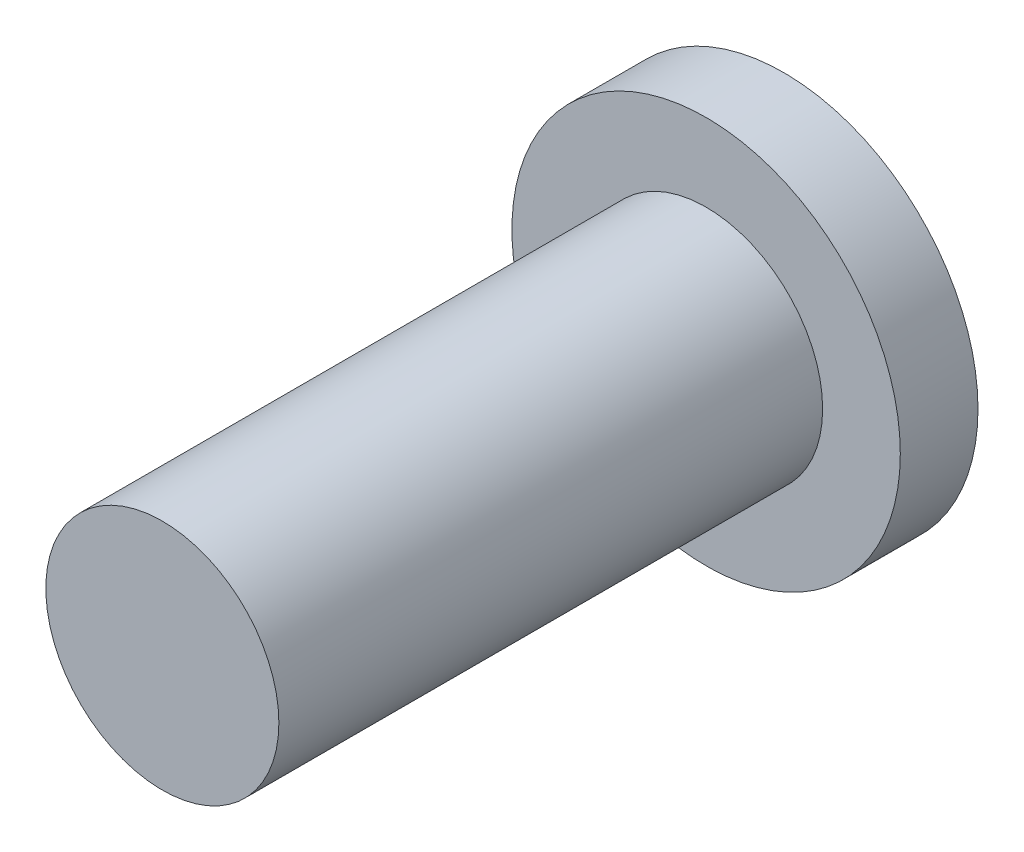
ISO-10303-21;
HEADER;
FILE_DESCRIPTION(('STEP AP214'),'2;1');
FILE_NAME('part.step','',(''),(''),'','','');
FILE_SCHEMA(('AUTOMOTIVE_DESIGN { 1 0 10303 214 1 1 1 1 }'));
ENDSEC;
DATA;
#1=APPLICATION_CONTEXT('core data for automotive mechanical design processes');
#2=APPLICATION_PROTOCOL_DEFINITION('international standard','automotive_design',2000,#1);
#3=PRODUCT_CONTEXT('',#1,'mechanical');
#4=PRODUCT('Part','Part','',(#3));
#5=PRODUCT_RELATED_PRODUCT_CATEGORY('part','',(#4));
#6=PRODUCT_DEFINITION_FORMATION('','',#4);
#7=PRODUCT_DEFINITION_CONTEXT('part definition',#1,'design');
#8=PRODUCT_DEFINITION('design','',#6,#7);
#9=PRODUCT_DEFINITION_SHAPE('','',#8);
#10=(LENGTH_UNIT() NAMED_UNIT(*) SI_UNIT(.MILLI.,.METRE.));
#11=(NAMED_UNIT(*) PLANE_ANGLE_UNIT() SI_UNIT($,.RADIAN.));
#12=(NAMED_UNIT(*) SI_UNIT($,.STERADIAN.) SOLID_ANGLE_UNIT());
#13=UNCERTAINTY_MEASURE_WITH_UNIT(LENGTH_MEASURE(1.E-05),#10,'distance_accuracy_value','');
#14=(GEOMETRIC_REPRESENTATION_CONTEXT(3) GLOBAL_UNCERTAINTY_ASSIGNED_CONTEXT((#13)) GLOBAL_UNIT_ASSIGNED_CONTEXT((#10,
#11,#12)) REPRESENTATION_CONTEXT('',''));
#15=CARTESIAN_POINT('',(0.,0.,0.));
#16=DIRECTION('',(0.,0.,1.));
#17=DIRECTION('',(1.,0.,0.));
#18=AXIS2_PLACEMENT_3D('',#15,#16,#17);
#19=CARTESIAN_POINT('',(0.,0.,5.));
#20=DIRECTION('',(0.,0.,1.));
#21=DIRECTION('',(1.,0.,0.));
#22=AXIS2_PLACEMENT_3D('',#19,#20,#21);
#23=PLANE('',#22);
#24=CARTESIAN_POINT('',(0.,0.,5.));
#25=DIRECTION('',(0.,0.,1.));
#26=DIRECTION('',(1.,0.,0.));
#27=AXIS2_PLACEMENT_3D('',#24,#25,#26);
#28=CIRCLE('',#27,12.5);
#29=CARTESIAN_POINT('',(12.5,0.,5.));
#30=VERTEX_POINT('',#29);
#31=EDGE_CURVE('E10',#30,#30,#28,.T.);
#32=ORIENTED_EDGE('',*,*,#31,.T.);
#33=EDGE_LOOP('',(#32));
#34=FACE_BOUND('',#33,.T.);
#35=CARTESIAN_POINT('',(0.,0.,5.));
#36=DIRECTION('',(0.,0.,1.));
#37=DIRECTION('',(1.,0.,0.));
#38=AXIS2_PLACEMENT_3D('',#35,#36,#37);
#39=CIRCLE('',#38,7.5);
#40=CARTESIAN_POINT('',(7.5,0.,5.));
#41=VERTEX_POINT('',#40);
#42=EDGE_CURVE('E42',#41,#41,#39,.T.);
#43=ORIENTED_EDGE('',*,*,#42,.F.);
#44=EDGE_LOOP('',(#43));
#45=FACE_BOUND('',#44,.T.);
#46=ADVANCED_FACE('F31',(#34,#45),#23,.T.);
#47=CARTESIAN_POINT('',(0.,0.,0.));
#48=DIRECTION('',(0.,0.,1.));
#49=DIRECTION('',(1.,0.,0.));
#50=AXIS2_PLACEMENT_3D('',#47,#48,#49);
#51=PLANE('',#50);
#52=CARTESIAN_POINT('',(0.,0.,0.));
#53=DIRECTION('',(0.,0.,1.));
#54=DIRECTION('',(1.,0.,0.));
#55=AXIS2_PLACEMENT_3D('',#52,#53,#54);
#56=CIRCLE('',#55,12.5);
#57=CARTESIAN_POINT('',(12.5,0.,0.));
#58=VERTEX_POINT('',#57);
#59=EDGE_CURVE('E35',#58,#58,#56,.T.);
#60=ORIENTED_EDGE('',*,*,#59,.F.);
#61=EDGE_LOOP('',(#60));
#62=FACE_BOUND('',#61,.T.);
#63=ADVANCED_FACE('F61',(#62),#51,.F.);
#64=CARTESIAN_POINT('',(0.,0.,5.));
#65=DIRECTION('',(0.,0.,-1.));
#66=DIRECTION('',(-1.,0.,0.));
#67=AXIS2_PLACEMENT_3D('',#64,#65,#66);
#68=CYLINDRICAL_SURFACE('',#67,12.5);
#69=ORIENTED_EDGE('',*,*,#31,.F.);
#70=EDGE_LOOP('',(#69));
#71=FACE_BOUND('',#70,.T.);
#72=ORIENTED_EDGE('',*,*,#59,.T.);
#73=EDGE_LOOP('',(#72));
#74=FACE_BOUND('',#73,.T.);
#75=ADVANCED_FACE('F33',(#71,#74),#68,.T.);
#76=CARTESIAN_POINT('',(0.,0.,40.));
#77=DIRECTION('',(0.,0.,-1.));
#78=DIRECTION('',(-1.,0.,0.));
#79=AXIS2_PLACEMENT_3D('',#76,#77,#78);
#80=CYLINDRICAL_SURFACE('',#79,7.5);
#81=ORIENTED_EDGE('',*,*,#42,.T.);
#82=EDGE_LOOP('',(#81));
#83=FACE_BOUND('',#82,.T.);
#84=CARTESIAN_POINT('',(0.,0.,40.));
#85=DIRECTION('',(0.,0.,1.));
#86=DIRECTION('',(1.,0.,0.));
#87=AXIS2_PLACEMENT_3D('',#84,#85,#86);
#88=CIRCLE('',#87,7.5);
#89=CARTESIAN_POINT('',(7.5,0.,40.));
#90=VERTEX_POINT('',#89);
#91=EDGE_CURVE('E46',#90,#90,#88,.T.);
#92=ORIENTED_EDGE('',*,*,#91,.F.);
#93=EDGE_LOOP('',(#92));
#94=FACE_BOUND('',#93,.T.);
#95=ADVANCED_FACE('F52',(#83,#94),#80,.T.);
#96=CARTESIAN_POINT('',(0.,0.,40.));
#97=DIRECTION('',(0.,0.,1.));
#98=DIRECTION('',(1.,0.,0.));
#99=AXIS2_PLACEMENT_3D('',#96,#97,#98);
#100=PLANE('',#99);
#101=ORIENTED_EDGE('',*,*,#91,.T.);
#102=EDGE_LOOP('',(#101));
#103=FACE_BOUND('',#102,.T.);
#104=ADVANCED_FACE('F50',(#103),#100,.T.);
#105=CLOSED_SHELL('',(#46,#63,#75,#95,#104));
#106=MANIFOLD_SOLID_BREP('B2',#105);
#107=ADVANCED_BREP_SHAPE_REPRESENTATION('',(#18,#106),#14);
#108=SHAPE_DEFINITION_REPRESENTATION(#9,#107);
ENDSEC;
END-ISO-10303-21;
